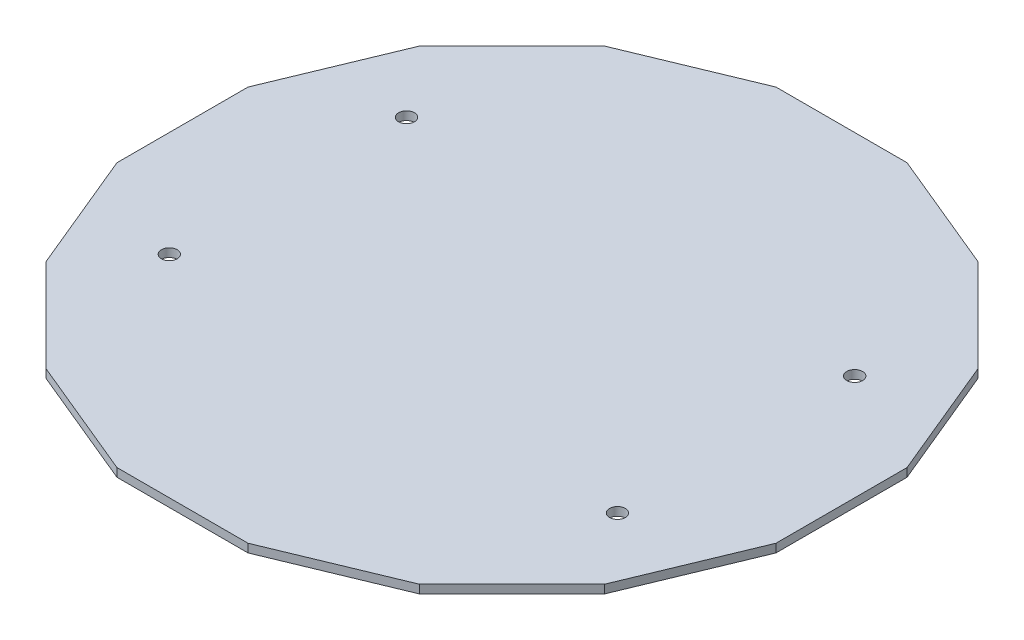
ISO-10303-21;
HEADER;
FILE_DESCRIPTION(('STEP AP214'),'2;1');
FILE_NAME('part.step','',(''),(''),'','','');
FILE_SCHEMA(('AUTOMOTIVE_DESIGN { 1 0 10303 214 1 1 1 1 }'));
ENDSEC;
DATA;
#1=APPLICATION_CONTEXT('core data for automotive mechanical design processes');
#2=APPLICATION_PROTOCOL_DEFINITION('international standard','automotive_design',2000,#1);
#3=PRODUCT_CONTEXT('',#1,'mechanical');
#4=PRODUCT('Part','Part','',(#3));
#5=PRODUCT_RELATED_PRODUCT_CATEGORY('part','',(#4));
#6=PRODUCT_DEFINITION_FORMATION('','',#4);
#7=PRODUCT_DEFINITION_CONTEXT('part definition',#1,'design');
#8=PRODUCT_DEFINITION('design','',#6,#7);
#9=PRODUCT_DEFINITION_SHAPE('','',#8);
#10=(LENGTH_UNIT() NAMED_UNIT(*) SI_UNIT(.MILLI.,.METRE.));
#11=(NAMED_UNIT(*) PLANE_ANGLE_UNIT() SI_UNIT($,.RADIAN.));
#12=(NAMED_UNIT(*) SI_UNIT($,.STERADIAN.) SOLID_ANGLE_UNIT());
#13=UNCERTAINTY_MEASURE_WITH_UNIT(LENGTH_MEASURE(1.E-05),#10,'distance_accuracy_value','');
#14=(GEOMETRIC_REPRESENTATION_CONTEXT(3) GLOBAL_UNCERTAINTY_ASSIGNED_CONTEXT((#13)) GLOBAL_UNIT_ASSIGNED_CONTEXT((#10,
#11,#12)) REPRESENTATION_CONTEXT('',''));
#15=CARTESIAN_POINT('',(0.,0.,0.));
#16=DIRECTION('',(0.,0.,1.));
#17=DIRECTION('',(1.,0.,0.));
#18=AXIS2_PLACEMENT_3D('',#15,#16,#17);
#19=CARTESIAN_POINT('',(62.5,1.6,12.4320229612286));
#20=DIRECTION('',(-1.,0.,0.));
#21=DIRECTION('',(0.,0.,1.));
#22=AXIS2_PLACEMENT_3D('',#19,#20,#21);
#23=PLANE('',#22);
#24=DIRECTION('',(0.,0.,-1.));
#25=VECTOR('',#24,1.);
#26=CARTESIAN_POINT('',(62.5,0.,12.4320229612286));
#27=LINE('',#26,#25);
#28=CARTESIAN_POINT('',(62.5,0.,12.4320229612286));
#29=VERTEX_POINT('',#28);
#30=CARTESIAN_POINT('',(62.5,0.,-12.4320229612286));
#31=VERTEX_POINT('',#30);
#32=EDGE_CURVE('E196',#29,#31,#27,.T.);
#33=ORIENTED_EDGE('',*,*,#32,.T.);
#34=DIRECTION('',(0.,-1.,0.));
#35=VECTOR('',#34,1.);
#36=CARTESIAN_POINT('',(62.5,1.6,-12.4320229612286));
#37=LINE('',#36,#35);
#38=CARTESIAN_POINT('',(62.5,1.6,-12.4320229612286));
#39=VERTEX_POINT('',#38);
#40=EDGE_CURVE('E11',#39,#31,#37,.T.);
#41=ORIENTED_EDGE('',*,*,#40,.F.);
#42=DIRECTION('',(0.,0.,-1.));
#43=VECTOR('',#42,1.);
#44=CARTESIAN_POINT('',(62.5,1.6,12.4320229612286));
#45=LINE('',#44,#43);
#46=CARTESIAN_POINT('',(62.5,1.6,12.4320229612286));
#47=VERTEX_POINT('',#46);
#48=EDGE_CURVE('E243',#47,#39,#45,.T.);
#49=ORIENTED_EDGE('',*,*,#48,.F.);
#50=DIRECTION('',(0.,-1.,0.));
#51=VECTOR('',#50,1.);
#52=CARTESIAN_POINT('',(62.5,1.6,12.4320229612286));
#53=LINE('',#52,#51);
#54=EDGE_CURVE('E192',#47,#29,#53,.T.);
#55=ORIENTED_EDGE('',*,*,#54,.T.);
#56=EDGE_LOOP('',(#33,#41,#49,#55));
#57=FACE_BOUND('',#56,.T.);
#58=ADVANCED_FACE('F47',(#57),#23,.F.);
#59=CARTESIAN_POINT('',(62.5,1.6,-12.4320229612286));
#60=DIRECTION('',(-0.923879532511287,0.,0.38268343236509));
#61=DIRECTION('',(0.38268343236509,0.,0.923879532511287));
#62=AXIS2_PLACEMENT_3D('',#59,#60,#61);
#63=PLANE('',#62);
#64=DIRECTION('',(-0.38268343236509,0.,-0.923879532511287));
#65=VECTOR('',#64,1.);
#66=CARTESIAN_POINT('',(62.5,0.,-12.4320229612286));
#67=LINE('',#66,#65);
#68=CARTESIAN_POINT('',(52.9849415639108,0.,-35.4034060844076));
#69=VERTEX_POINT('',#68);
#70=EDGE_CURVE('E200',#31,#69,#67,.T.);
#71=ORIENTED_EDGE('',*,*,#70,.T.);
#72=DIRECTION('',(0.,-1.,0.));
#73=VECTOR('',#72,1.);
#74=CARTESIAN_POINT('',(52.9849415639108,1.6,-35.4034060844076));
#75=LINE('',#74,#73);
#76=CARTESIAN_POINT('',(52.9849415639108,1.6,-35.4034060844076));
#77=VERTEX_POINT('',#76);
#78=EDGE_CURVE('E56',#77,#69,#75,.T.);
#79=ORIENTED_EDGE('',*,*,#78,.F.);
#80=DIRECTION('',(-0.38268343236509,0.,-0.923879532511287));
#81=VECTOR('',#80,1.);
#82=CARTESIAN_POINT('',(62.5,1.6,-12.4320229612286));
#83=LINE('',#82,#81);
#84=EDGE_CURVE('E131',#39,#77,#83,.T.);
#85=ORIENTED_EDGE('',*,*,#84,.F.);
#86=ORIENTED_EDGE('',*,*,#40,.T.);
#87=EDGE_LOOP('',(#71,#79,#85,#86));
#88=FACE_BOUND('',#87,.T.);
#89=ADVANCED_FACE('F366',(#88),#63,.F.);
#90=CARTESIAN_POINT('',(52.9849415639108,1.6,-35.4034060844076));
#91=DIRECTION('',(-0.707106781186548,0.,0.707106781186548));
#92=DIRECTION('',(0.707106781186548,0.,0.707106781186548));
#93=AXIS2_PLACEMENT_3D('',#90,#91,#92);
#94=PLANE('',#93);
#95=DIRECTION('',(-0.707106781186547,0.,-0.707106781186547));
#96=VECTOR('',#95,1.);
#97=CARTESIAN_POINT('',(52.9849415639108,0.,-35.4034060844076));
#98=LINE('',#97,#96);
#99=CARTESIAN_POINT('',(35.4034060844076,0.,-52.9849415639108));
#100=VERTEX_POINT('',#99);
#101=EDGE_CURVE('E204',#69,#100,#98,.T.);
#102=ORIENTED_EDGE('',*,*,#101,.T.);
#103=DIRECTION('',(0.,-1.,0.));
#104=VECTOR('',#103,1.);
#105=CARTESIAN_POINT('',(35.4034060844076,1.6,-52.9849415639108));
#106=LINE('',#105,#104);
#107=CARTESIAN_POINT('',(35.4034060844076,1.6,-52.9849415639108));
#108=VERTEX_POINT('',#107);
#109=EDGE_CURVE('E286',#108,#100,#106,.T.);
#110=ORIENTED_EDGE('',*,*,#109,.F.);
#111=DIRECTION('',(-0.707106781186547,0.,-0.707106781186547));
#112=VECTOR('',#111,1.);
#113=CARTESIAN_POINT('',(52.9849415639108,1.6,-35.4034060844076));
#114=LINE('',#113,#112);
#115=EDGE_CURVE('E296',#77,#108,#114,.T.);
#116=ORIENTED_EDGE('',*,*,#115,.F.);
#117=ORIENTED_EDGE('',*,*,#78,.T.);
#118=EDGE_LOOP('',(#102,#110,#116,#117));
#119=FACE_BOUND('',#118,.T.);
#120=ADVANCED_FACE('F294',(#119),#94,.F.);
#121=CARTESIAN_POINT('',(35.4034060844076,1.6,-52.9849415639108));
#122=DIRECTION('',(-0.382683432365089,0.,0.923879532511287));
#123=DIRECTION('',(0.923879532511287,0.,0.382683432365089));
#124=AXIS2_PLACEMENT_3D('',#121,#122,#123);
#125=PLANE('',#124);
#126=DIRECTION('',(-0.923879532511287,0.,-0.382683432365089));
#127=VECTOR('',#126,1.);
#128=CARTESIAN_POINT('',(35.4034060844076,0.,-52.9849415639108));
#129=LINE('',#128,#127);
#130=CARTESIAN_POINT('',(12.4320229612286,0.,-62.5));
#131=VERTEX_POINT('',#130);
#132=EDGE_CURVE('E207',#100,#131,#129,.T.);
#133=ORIENTED_EDGE('',*,*,#132,.T.);
#134=DIRECTION('',(0.,-1.,0.));
#135=VECTOR('',#134,1.);
#136=CARTESIAN_POINT('',(12.4320229612286,1.6,-62.5));
#137=LINE('',#136,#135);
#138=CARTESIAN_POINT('',(12.4320229612286,1.6,-62.5));
#139=VERTEX_POINT('',#138);
#140=EDGE_CURVE('E282',#139,#131,#137,.T.);
#141=ORIENTED_EDGE('',*,*,#140,.F.);
#142=DIRECTION('',(-0.923879532511287,0.,-0.382683432365089));
#143=VECTOR('',#142,1.);
#144=CARTESIAN_POINT('',(35.4034060844076,1.6,-52.9849415639108));
#145=LINE('',#144,#143);
#146=EDGE_CURVE('E315',#108,#139,#145,.T.);
#147=ORIENTED_EDGE('',*,*,#146,.F.);
#148=ORIENTED_EDGE('',*,*,#109,.T.);
#149=EDGE_LOOP('',(#133,#141,#147,#148));
#150=FACE_BOUND('',#149,.T.);
#151=ADVANCED_FACE('F305',(#150),#125,.F.);
#152=CARTESIAN_POINT('',(12.4320229612286,1.6,-62.5));
#153=DIRECTION('',(0.,0.,1.));
#154=DIRECTION('',(1.,0.,0.));
#155=AXIS2_PLACEMENT_3D('',#152,#153,#154);
#156=PLANE('',#155);
#157=DIRECTION('',(-1.,0.,0.));
#158=VECTOR('',#157,1.);
#159=CARTESIAN_POINT('',(12.4320229612286,0.,-62.5));
#160=LINE('',#159,#158);
#161=CARTESIAN_POINT('',(-12.4320229612286,0.,-62.5));
#162=VERTEX_POINT('',#161);
#163=EDGE_CURVE('E210',#131,#162,#160,.T.);
#164=ORIENTED_EDGE('',*,*,#163,.T.);
#165=DIRECTION('',(0.,-1.,0.));
#166=VECTOR('',#165,1.);
#167=CARTESIAN_POINT('',(-12.4320229612286,1.6,-62.5));
#168=LINE('',#167,#166);
#169=CARTESIAN_POINT('',(-12.4320229612286,1.6,-62.5));
#170=VERTEX_POINT('',#169);
#171=EDGE_CURVE('E278',#170,#162,#168,.T.);
#172=ORIENTED_EDGE('',*,*,#171,.F.);
#173=DIRECTION('',(-1.,0.,0.));
#174=VECTOR('',#173,1.);
#175=CARTESIAN_POINT('',(12.4320229612286,1.6,-62.5));
#176=LINE('',#175,#174);
#177=EDGE_CURVE('E311',#139,#170,#176,.T.);
#178=ORIENTED_EDGE('',*,*,#177,.F.);
#179=ORIENTED_EDGE('',*,*,#140,.T.);
#180=EDGE_LOOP('',(#164,#172,#178,#179));
#181=FACE_BOUND('',#180,.T.);
#182=ADVANCED_FACE('F309',(#181),#156,.F.);
#183=CARTESIAN_POINT('',(-12.4320229612286,1.6,-62.5));
#184=DIRECTION('',(0.38268343236509,0.,0.923879532511287));
#185=DIRECTION('',(0.923879532511287,0.,-0.38268343236509));
#186=AXIS2_PLACEMENT_3D('',#183,#184,#185);
#187=PLANE('',#186);
#188=DIRECTION('',(-0.923879532511287,0.,0.38268343236509));
#189=VECTOR('',#188,1.);
#190=CARTESIAN_POINT('',(-12.4320229612286,0.,-62.5));
#191=LINE('',#190,#189);
#192=CARTESIAN_POINT('',(-35.4034060844076,0.,-52.9849415639108));
#193=VERTEX_POINT('',#192);
#194=EDGE_CURVE('E213',#162,#193,#191,.T.);
#195=ORIENTED_EDGE('',*,*,#194,.T.);
#196=DIRECTION('',(0.,-1.,0.));
#197=VECTOR('',#196,1.);
#198=CARTESIAN_POINT('',(-35.4034060844076,1.6,-52.9849415639108));
#199=LINE('',#198,#197);
#200=CARTESIAN_POINT('',(-35.4034060844076,1.6,-52.9849415639108));
#201=VERTEX_POINT('',#200);
#202=EDGE_CURVE('E274',#201,#193,#199,.T.);
#203=ORIENTED_EDGE('',*,*,#202,.F.);
#204=DIRECTION('',(-0.923879532511287,0.,0.38268343236509));
#205=VECTOR('',#204,1.);
#206=CARTESIAN_POINT('',(-12.4320229612286,1.6,-62.5));
#207=LINE('',#206,#205);
#208=EDGE_CURVE('E314',#170,#201,#207,.T.);
#209=ORIENTED_EDGE('',*,*,#208,.F.);
#210=ORIENTED_EDGE('',*,*,#171,.T.);
#211=EDGE_LOOP('',(#195,#203,#209,#210));
#212=FACE_BOUND('',#211,.T.);
#213=ADVANCED_FACE('F379',(#212),#187,.F.);
#214=CARTESIAN_POINT('',(-35.4034060844076,1.6,-52.9849415639108));
#215=DIRECTION('',(0.707106781186548,0.,0.707106781186547));
#216=DIRECTION('',(0.707106781186547,0.,-0.707106781186548));
#217=AXIS2_PLACEMENT_3D('',#214,#215,#216);
#218=PLANE('',#217);
#219=DIRECTION('',(-0.707106781186547,0.,0.707106781186548));
#220=VECTOR('',#219,1.);
#221=CARTESIAN_POINT('',(-35.4034060844076,0.,-52.9849415639108));
#222=LINE('',#221,#220);
#223=CARTESIAN_POINT('',(-52.9849415639109,0.,-35.4034060844075));
#224=VERTEX_POINT('',#223);
#225=EDGE_CURVE('E216',#193,#224,#222,.T.);
#226=ORIENTED_EDGE('',*,*,#225,.T.);
#227=DIRECTION('',(0.,-1.,0.));
#228=VECTOR('',#227,1.);
#229=CARTESIAN_POINT('',(-52.9849415639109,1.6,-35.4034060844075));
#230=LINE('',#229,#228);
#231=CARTESIAN_POINT('',(-52.9849415639109,1.6,-35.4034060844075));
#232=VERTEX_POINT('',#231);
#233=EDGE_CURVE('E270',#232,#224,#230,.T.);
#234=ORIENTED_EDGE('',*,*,#233,.F.);
#235=DIRECTION('',(-0.707106781186547,0.,0.707106781186548));
#236=VECTOR('',#235,1.);
#237=CARTESIAN_POINT('',(-35.4034060844076,1.6,-52.9849415639108));
#238=LINE('',#237,#236);
#239=EDGE_CURVE('E319',#201,#232,#238,.T.);
#240=ORIENTED_EDGE('',*,*,#239,.F.);
#241=ORIENTED_EDGE('',*,*,#202,.T.);
#242=EDGE_LOOP('',(#226,#234,#240,#241));
#243=FACE_BOUND('',#242,.T.);
#244=ADVANCED_FACE('F382',(#243),#218,.F.);
#245=CARTESIAN_POINT('',(-52.9849415639109,1.6,-35.4034060844075));
#246=DIRECTION('',(0.923879532511287,0.,0.382683432365089));
#247=DIRECTION('',(0.38268343236509,0.,-0.923879532511287));
#248=AXIS2_PLACEMENT_3D('',#245,#246,#247);
#249=PLANE('',#248);
#250=DIRECTION('',(-0.382683432365089,0.,0.923879532511287));
#251=VECTOR('',#250,1.);
#252=CARTESIAN_POINT('',(-52.9849415639109,0.,-35.4034060844075));
#253=LINE('',#252,#251);
#254=CARTESIAN_POINT('',(-62.5,0.,-12.4320229612286));
#255=VERTEX_POINT('',#254);
#256=EDGE_CURVE('E219',#224,#255,#253,.T.);
#257=ORIENTED_EDGE('',*,*,#256,.T.);
#258=DIRECTION('',(0.,-1.,0.));
#259=VECTOR('',#258,1.);
#260=CARTESIAN_POINT('',(-62.5,1.6,-12.4320229612286));
#261=LINE('',#260,#259);
#262=CARTESIAN_POINT('',(-62.5,1.6,-12.4320229612286));
#263=VERTEX_POINT('',#262);
#264=EDGE_CURVE('E266',#263,#255,#261,.T.);
#265=ORIENTED_EDGE('',*,*,#264,.F.);
#266=DIRECTION('',(-0.382683432365089,0.,0.923879532511287));
#267=VECTOR('',#266,1.);
#268=CARTESIAN_POINT('',(-52.9849415639109,1.6,-35.4034060844075));
#269=LINE('',#268,#267);
#270=EDGE_CURVE('E326',#232,#263,#269,.T.);
#271=ORIENTED_EDGE('',*,*,#270,.F.);
#272=ORIENTED_EDGE('',*,*,#233,.T.);
#273=EDGE_LOOP('',(#257,#265,#271,#272));
#274=FACE_BOUND('',#273,.T.);
#275=ADVANCED_FACE('F386',(#274),#249,.F.);
#276=CARTESIAN_POINT('',(-62.5,1.6,-12.4320229612286));
#277=DIRECTION('',(1.,0.,0.));
#278=DIRECTION('',(0.,0.,-1.));
#279=AXIS2_PLACEMENT_3D('',#276,#277,#278);
#280=PLANE('',#279);
#281=DIRECTION('',(0.,0.,1.));
#282=VECTOR('',#281,1.);
#283=CARTESIAN_POINT('',(-62.5,0.,-12.4320229612286));
#284=LINE('',#283,#282);
#285=CARTESIAN_POINT('',(-62.5,0.,12.4320229612287));
#286=VERTEX_POINT('',#285);
#287=EDGE_CURVE('E222',#255,#286,#284,.T.);
#288=ORIENTED_EDGE('',*,*,#287,.T.);
#289=DIRECTION('',(0.,-1.,0.));
#290=VECTOR('',#289,1.);
#291=CARTESIAN_POINT('',(-62.5,1.6,12.4320229612287));
#292=LINE('',#291,#290);
#293=CARTESIAN_POINT('',(-62.5,1.6,12.4320229612287));
#294=VERTEX_POINT('',#293);
#295=EDGE_CURVE('E262',#294,#286,#292,.T.);
#296=ORIENTED_EDGE('',*,*,#295,.F.);
#297=DIRECTION('',(0.,0.,1.));
#298=VECTOR('',#297,1.);
#299=CARTESIAN_POINT('',(-62.5,1.6,-12.4320229612286));
#300=LINE('',#299,#298);
#301=EDGE_CURVE('E329',#263,#294,#300,.T.);
#302=ORIENTED_EDGE('',*,*,#301,.F.);
#303=ORIENTED_EDGE('',*,*,#264,.T.);
#304=EDGE_LOOP('',(#288,#296,#302,#303));
#305=FACE_BOUND('',#304,.T.);
#306=ADVANCED_FACE('F390',(#305),#280,.F.);
#307=CARTESIAN_POINT('',(-62.5,1.6,12.4320229612287));
#308=DIRECTION('',(0.923879532511287,0.,-0.38268343236509));
#309=DIRECTION('',(-0.38268343236509,0.,-0.923879532511287));
#310=AXIS2_PLACEMENT_3D('',#307,#308,#309);
#311=PLANE('',#310);
#312=DIRECTION('',(0.38268343236509,0.,0.923879532511287));
#313=VECTOR('',#312,1.);
#314=CARTESIAN_POINT('',(-62.5,0.,12.4320229612287));
#315=LINE('',#314,#313);
#316=CARTESIAN_POINT('',(-52.9849415639108,0.,35.4034060844077));
#317=VERTEX_POINT('',#316);
#318=EDGE_CURVE('E225',#286,#317,#315,.T.);
#319=ORIENTED_EDGE('',*,*,#318,.T.);
#320=DIRECTION('',(0.,-1.,0.));
#321=VECTOR('',#320,1.);
#322=CARTESIAN_POINT('',(-52.9849415639108,1.6,35.4034060844077));
#323=LINE('',#322,#321);
#324=CARTESIAN_POINT('',(-52.9849415639108,1.6,35.4034060844077));
#325=VERTEX_POINT('',#324);
#326=EDGE_CURVE('E258',#325,#317,#323,.T.);
#327=ORIENTED_EDGE('',*,*,#326,.F.);
#328=DIRECTION('',(0.38268343236509,0.,0.923879532511287));
#329=VECTOR('',#328,1.);
#330=CARTESIAN_POINT('',(-62.5,1.6,12.4320229612287));
#331=LINE('',#330,#329);
#332=EDGE_CURVE('E332',#294,#325,#331,.T.);
#333=ORIENTED_EDGE('',*,*,#332,.F.);
#334=ORIENTED_EDGE('',*,*,#295,.T.);
#335=EDGE_LOOP('',(#319,#327,#333,#334));
#336=FACE_BOUND('',#335,.T.);
#337=ADVANCED_FACE('F394',(#336),#311,.F.);
#338=CARTESIAN_POINT('',(-52.9849415639108,1.6,35.4034060844077));
#339=DIRECTION('',(0.707106781186547,0.,-0.707106781186548));
#340=DIRECTION('',(-0.707106781186548,0.,-0.707106781186547));
#341=AXIS2_PLACEMENT_3D('',#338,#339,#340);
#342=PLANE('',#341);
#343=DIRECTION('',(0.707106781186548,0.,0.707106781186547));
#344=VECTOR('',#343,1.);
#345=CARTESIAN_POINT('',(-52.9849415639108,0.,35.4034060844077));
#346=LINE('',#345,#344);
#347=CARTESIAN_POINT('',(-35.4034060844076,0.,52.9849415639109));
#348=VERTEX_POINT('',#347);
#349=EDGE_CURVE('E228',#317,#348,#346,.T.);
#350=ORIENTED_EDGE('',*,*,#349,.T.);
#351=DIRECTION('',(0.,-1.,0.));
#352=VECTOR('',#351,1.);
#353=CARTESIAN_POINT('',(-35.4034060844076,1.6,52.9849415639109));
#354=LINE('',#353,#352);
#355=CARTESIAN_POINT('',(-35.4034060844076,1.6,52.9849415639109));
#356=VERTEX_POINT('',#355);
#357=EDGE_CURVE('E254',#356,#348,#354,.T.);
#358=ORIENTED_EDGE('',*,*,#357,.F.);
#359=DIRECTION('',(0.707106781186548,0.,0.707106781186547));
#360=VECTOR('',#359,1.);
#361=CARTESIAN_POINT('',(-52.9849415639108,1.6,35.4034060844077));
#362=LINE('',#361,#360);
#363=EDGE_CURVE('E335',#325,#356,#362,.T.);
#364=ORIENTED_EDGE('',*,*,#363,.F.);
#365=ORIENTED_EDGE('',*,*,#326,.T.);
#366=EDGE_LOOP('',(#350,#358,#364,#365));
#367=FACE_BOUND('',#366,.T.);
#368=ADVANCED_FACE('F398',(#367),#342,.F.);
#369=CARTESIAN_POINT('',(-35.4034060844076,1.6,52.9849415639109));
#370=DIRECTION('',(0.382683432365089,0.,-0.923879532511287));
#371=DIRECTION('',(-0.923879532511287,0.,-0.382683432365089));
#372=AXIS2_PLACEMENT_3D('',#369,#370,#371);
#373=PLANE('',#372);
#374=DIRECTION('',(0.923879532511287,0.,0.382683432365089));
#375=VECTOR('',#374,1.);
#376=CARTESIAN_POINT('',(-35.4034060844076,0.,52.9849415639109));
#377=LINE('',#376,#375);
#378=CARTESIAN_POINT('',(-12.4320229612286,0.,62.5));
#379=VERTEX_POINT('',#378);
#380=EDGE_CURVE('E231',#348,#379,#377,.T.);
#381=ORIENTED_EDGE('',*,*,#380,.T.);
#382=DIRECTION('',(0.,-1.,0.));
#383=VECTOR('',#382,1.);
#384=CARTESIAN_POINT('',(-12.4320229612286,1.6,62.5));
#385=LINE('',#384,#383);
#386=CARTESIAN_POINT('',(-12.4320229612286,1.6,62.5));
#387=VERTEX_POINT('',#386);
#388=EDGE_CURVE('E250',#387,#379,#385,.T.);
#389=ORIENTED_EDGE('',*,*,#388,.F.);
#390=DIRECTION('',(0.923879532511287,0.,0.382683432365089));
#391=VECTOR('',#390,1.);
#392=CARTESIAN_POINT('',(-35.4034060844076,1.6,52.9849415639109));
#393=LINE('',#392,#391);
#394=EDGE_CURVE('E338',#356,#387,#393,.T.);
#395=ORIENTED_EDGE('',*,*,#394,.F.);
#396=ORIENTED_EDGE('',*,*,#357,.T.);
#397=EDGE_LOOP('',(#381,#389,#395,#396));
#398=FACE_BOUND('',#397,.T.);
#399=ADVANCED_FACE('F346',(#398),#373,.F.);
#400=CARTESIAN_POINT('',(-12.4320229612286,1.6,62.5));
#401=DIRECTION('',(0.,0.,-1.));
#402=DIRECTION('',(-1.,0.,0.));
#403=AXIS2_PLACEMENT_3D('',#400,#401,#402);
#404=PLANE('',#403);
#405=DIRECTION('',(1.,0.,0.));
#406=VECTOR('',#405,1.);
#407=CARTESIAN_POINT('',(-12.4320229612286,0.,62.5));
#408=LINE('',#407,#406);
#409=CARTESIAN_POINT('',(12.4320229612287,0.,62.5));
#410=VERTEX_POINT('',#409);
#411=EDGE_CURVE('E234',#379,#410,#408,.T.);
#412=ORIENTED_EDGE('',*,*,#411,.T.);
#413=DIRECTION('',(0.,-1.,0.));
#414=VECTOR('',#413,1.);
#415=CARTESIAN_POINT('',(12.4320229612287,1.6,62.5));
#416=LINE('',#415,#414);
#417=CARTESIAN_POINT('',(12.4320229612287,1.6,62.5));
#418=VERTEX_POINT('',#417);
#419=EDGE_CURVE('E185',#418,#410,#416,.T.);
#420=ORIENTED_EDGE('',*,*,#419,.F.);
#421=DIRECTION('',(1.,0.,0.));
#422=VECTOR('',#421,1.);
#423=CARTESIAN_POINT('',(-12.4320229612286,1.6,62.5));
#424=LINE('',#423,#422);
#425=EDGE_CURVE('E174',#387,#418,#424,.T.);
#426=ORIENTED_EDGE('',*,*,#425,.F.);
#427=ORIENTED_EDGE('',*,*,#388,.T.);
#428=EDGE_LOOP('',(#412,#420,#426,#427));
#429=FACE_BOUND('',#428,.T.);
#430=ADVANCED_FACE('F350',(#429),#404,.F.);
#431=CARTESIAN_POINT('',(12.4320229612287,1.6,62.5));
#432=DIRECTION('',(-0.382683432365089,0.,-0.923879532511287));
#433=DIRECTION('',(-0.923879532511287,0.,0.382683432365089));
#434=AXIS2_PLACEMENT_3D('',#431,#432,#433);
#435=PLANE('',#434);
#436=DIRECTION('',(0.923879532511287,0.,-0.382683432365089));
#437=VECTOR('',#436,1.);
#438=CARTESIAN_POINT('',(12.4320229612287,0.,62.5));
#439=LINE('',#438,#437);
#440=CARTESIAN_POINT('',(35.4034060844076,0.,52.9849415639109));
#441=VERTEX_POINT('',#440);
#442=EDGE_CURVE('E183',#410,#441,#439,.T.);
#443=ORIENTED_EDGE('',*,*,#442,.T.);
#444=DIRECTION('',(0.,-1.,0.));
#445=VECTOR('',#444,1.);
#446=CARTESIAN_POINT('',(35.4034060844076,1.6,52.9849415639109));
#447=LINE('',#446,#445);
#448=CARTESIAN_POINT('',(35.4034060844076,1.6,52.9849415639109));
#449=VERTEX_POINT('',#448);
#450=EDGE_CURVE('E180',#449,#441,#447,.T.);
#451=ORIENTED_EDGE('',*,*,#450,.F.);
#452=DIRECTION('',(0.923879532511287,0.,-0.382683432365089));
#453=VECTOR('',#452,1.);
#454=CARTESIAN_POINT('',(12.4320229612287,1.6,62.5));
#455=LINE('',#454,#453);
#456=EDGE_CURVE('E168',#418,#449,#455,.T.);
#457=ORIENTED_EDGE('',*,*,#456,.F.);
#458=ORIENTED_EDGE('',*,*,#419,.T.);
#459=EDGE_LOOP('',(#443,#451,#457,#458));
#460=FACE_BOUND('',#459,.T.);
#461=ADVANCED_FACE('F181',(#460),#435,.F.);
#462=CARTESIAN_POINT('',(35.4034060844076,1.6,52.9849415639109));
#463=DIRECTION('',(-0.707106781186548,0.,-0.707106781186547));
#464=DIRECTION('',(-0.707106781186547,0.,0.707106781186548));
#465=AXIS2_PLACEMENT_3D('',#462,#463,#464);
#466=PLANE('',#465);
#467=DIRECTION('',(0.707106781186547,0.,-0.707106781186548));
#468=VECTOR('',#467,1.);
#469=CARTESIAN_POINT('',(35.4034060844076,0.,52.9849415639109));
#470=LINE('',#469,#468);
#471=CARTESIAN_POINT('',(52.9849415639109,0.,35.4034060844076));
#472=VERTEX_POINT('',#471);
#473=EDGE_CURVE('E117',#441,#472,#470,.T.);
#474=ORIENTED_EDGE('',*,*,#473,.T.);
#475=DIRECTION('',(0.,-1.,0.));
#476=VECTOR('',#475,1.);
#477=CARTESIAN_POINT('',(52.9849415639109,1.6,35.4034060844076));
#478=LINE('',#477,#476);
#479=CARTESIAN_POINT('',(52.9849415639109,1.6,35.4034060844076));
#480=VERTEX_POINT('',#479);
#481=EDGE_CURVE('E186',#480,#472,#478,.T.);
#482=ORIENTED_EDGE('',*,*,#481,.F.);
#483=DIRECTION('',(0.707106781186547,0.,-0.707106781186548));
#484=VECTOR('',#483,1.);
#485=CARTESIAN_POINT('',(35.4034060844076,1.6,52.9849415639109));
#486=LINE('',#485,#484);
#487=EDGE_CURVE('E172',#449,#480,#486,.T.);
#488=ORIENTED_EDGE('',*,*,#487,.F.);
#489=ORIENTED_EDGE('',*,*,#450,.T.);
#490=EDGE_LOOP('',(#474,#482,#488,#489));
#491=FACE_BOUND('',#490,.T.);
#492=ADVANCED_FACE('F188',(#491),#466,.F.);
#493=CARTESIAN_POINT('',(52.9849415639109,1.6,35.4034060844076));
#494=DIRECTION('',(-0.923879532511287,0.,-0.38268343236509));
#495=DIRECTION('',(-0.38268343236509,0.,0.923879532511287));
#496=AXIS2_PLACEMENT_3D('',#493,#494,#495);
#497=PLANE('',#496);
#498=DIRECTION('',(0.38268343236509,0.,-0.923879532511287));
#499=VECTOR('',#498,1.);
#500=CARTESIAN_POINT('',(52.9849415639109,0.,35.4034060844076));
#501=LINE('',#500,#499);
#502=EDGE_CURVE('E123',#472,#29,#501,.T.);
#503=ORIENTED_EDGE('',*,*,#502,.T.);
#504=ORIENTED_EDGE('',*,*,#54,.F.);
#505=DIRECTION('',(0.38268343236509,0.,-0.923879532511287));
#506=VECTOR('',#505,1.);
#507=CARTESIAN_POINT('',(52.9849415639109,1.6,35.4034060844076));
#508=LINE('',#507,#506);
#509=EDGE_CURVE('E64',#480,#47,#508,.T.);
#510=ORIENTED_EDGE('',*,*,#509,.F.);
#511=ORIENTED_EDGE('',*,*,#481,.T.);
#512=EDGE_LOOP('',(#503,#504,#510,#511));
#513=FACE_BOUND('',#512,.T.);
#514=ADVANCED_FACE('F354',(#513),#497,.F.);
#515=CARTESIAN_POINT('',(0.,1.6,0.));
#516=DIRECTION('',(0.,1.,0.));
#517=DIRECTION('',(0.,0.,1.));
#518=AXIS2_PLACEMENT_3D('',#515,#516,#517);
#519=PLANE('',#518);
#520=CARTESIAN_POINT('',(42.5,1.6,-22.5));
#521=DIRECTION('',(0.,1.,0.));
#522=DIRECTION('',(0.,0.,1.));
#523=AXIS2_PLACEMENT_3D('',#520,#521,#522);
#524=CIRCLE('',#523,1.5);
#525=CARTESIAN_POINT('',(42.5,1.6,-21.));
#526=VERTEX_POINT('',#525);
#527=EDGE_CURVE('E646',#526,#526,#524,.T.);
#528=ORIENTED_EDGE('',*,*,#527,.F.);
#529=EDGE_LOOP('',(#528));
#530=FACE_BOUND('',#529,.T.);
#531=CARTESIAN_POINT('',(42.5,1.6,22.5));
#532=DIRECTION('',(0.,1.,0.));
#533=DIRECTION('',(0.,0.,1.));
#534=AXIS2_PLACEMENT_3D('',#531,#532,#533);
#535=CIRCLE('',#534,1.5);
#536=CARTESIAN_POINT('',(42.5,1.6,24.));
#537=VERTEX_POINT('',#536);
#538=EDGE_CURVE('E653',#537,#537,#535,.T.);
#539=ORIENTED_EDGE('',*,*,#538,.F.);
#540=EDGE_LOOP('',(#539));
#541=FACE_BOUND('',#540,.T.);
#542=CARTESIAN_POINT('',(-42.5,1.6,22.5));
#543=DIRECTION('',(0.,1.,0.));
#544=DIRECTION('',(0.,0.,1.));
#545=AXIS2_PLACEMENT_3D('',#542,#543,#544);
#546=CIRCLE('',#545,1.5);
#547=CARTESIAN_POINT('',(-42.5,1.6,24.));
#548=VERTEX_POINT('',#547);
#549=EDGE_CURVE('E662',#548,#548,#546,.T.);
#550=ORIENTED_EDGE('',*,*,#549,.F.);
#551=EDGE_LOOP('',(#550));
#552=FACE_BOUND('',#551,.T.);
#553=CARTESIAN_POINT('',(-42.5,1.6,-22.5));
#554=DIRECTION('',(0.,1.,0.));
#555=DIRECTION('',(0.,0.,1.));
#556=AXIS2_PLACEMENT_3D('',#553,#554,#555);
#557=CIRCLE('',#556,1.5);
#558=CARTESIAN_POINT('',(-42.5,1.6,-21.));
#559=VERTEX_POINT('',#558);
#560=EDGE_CURVE('E658',#559,#559,#557,.T.);
#561=ORIENTED_EDGE('',*,*,#560,.F.);
#562=EDGE_LOOP('',(#561));
#563=FACE_BOUND('',#562,.T.);
#564=ORIENTED_EDGE('',*,*,#48,.T.);
#565=ORIENTED_EDGE('',*,*,#84,.T.);
#566=ORIENTED_EDGE('',*,*,#115,.T.);
#567=ORIENTED_EDGE('',*,*,#146,.T.);
#568=ORIENTED_EDGE('',*,*,#177,.T.);
#569=ORIENTED_EDGE('',*,*,#208,.T.);
#570=ORIENTED_EDGE('',*,*,#239,.T.);
#571=ORIENTED_EDGE('',*,*,#270,.T.);
#572=ORIENTED_EDGE('',*,*,#301,.T.);
#573=ORIENTED_EDGE('',*,*,#332,.T.);
#574=ORIENTED_EDGE('',*,*,#363,.T.);
#575=ORIENTED_EDGE('',*,*,#394,.T.);
#576=ORIENTED_EDGE('',*,*,#425,.T.);
#577=ORIENTED_EDGE('',*,*,#456,.T.);
#578=ORIENTED_EDGE('',*,*,#487,.T.);
#579=ORIENTED_EDGE('',*,*,#509,.T.);
#580=EDGE_LOOP('',(#564,#565,#566,#567,#568,#569,#570,#571,#572,#573,#574,#575,#576,#577,#578,#579));
#581=FACE_BOUND('',#580,.T.);
#582=ADVANCED_FACE('F170',(#530,#541,#552,#563,#581),#519,.T.);
#583=CARTESIAN_POINT('',(0.,0.,0.));
#584=DIRECTION('',(0.,1.,0.));
#585=DIRECTION('',(0.,0.,1.));
#586=AXIS2_PLACEMENT_3D('',#583,#584,#585);
#587=PLANE('',#586);
#588=CARTESIAN_POINT('',(42.5,0.,-22.5));
#589=DIRECTION('',(0.,1.,0.));
#590=DIRECTION('',(0.,0.,1.));
#591=AXIS2_PLACEMENT_3D('',#588,#589,#590);
#592=CIRCLE('',#591,1.5);
#593=CARTESIAN_POINT('',(42.5,0.,-21.));
#594=VERTEX_POINT('',#593);
#595=EDGE_CURVE('E643',#594,#594,#592,.F.);
#596=ORIENTED_EDGE('',*,*,#595,.F.);
#597=EDGE_LOOP('',(#596));
#598=FACE_BOUND('',#597,.T.);
#599=CARTESIAN_POINT('',(42.5,0.,22.5));
#600=DIRECTION('',(0.,1.,0.));
#601=DIRECTION('',(0.,0.,1.));
#602=AXIS2_PLACEMENT_3D('',#599,#600,#601);
#603=CIRCLE('',#602,1.5);
#604=CARTESIAN_POINT('',(42.5,0.,24.));
#605=VERTEX_POINT('',#604);
#606=EDGE_CURVE('E648',#605,#605,#603,.F.);
#607=ORIENTED_EDGE('',*,*,#606,.F.);
#608=EDGE_LOOP('',(#607));
#609=FACE_BOUND('',#608,.T.);
#610=CARTESIAN_POINT('',(-42.5,0.,22.5));
#611=DIRECTION('',(0.,1.,0.));
#612=DIRECTION('',(0.,0.,1.));
#613=AXIS2_PLACEMENT_3D('',#610,#611,#612);
#614=CIRCLE('',#613,1.5);
#615=CARTESIAN_POINT('',(-42.5,0.,24.));
#616=VERTEX_POINT('',#615);
#617=EDGE_CURVE('E673',#616,#616,#614,.F.);
#618=ORIENTED_EDGE('',*,*,#617,.F.);
#619=EDGE_LOOP('',(#618));
#620=FACE_BOUND('',#619,.T.);
#621=CARTESIAN_POINT('',(-42.5,0.,-22.5));
#622=DIRECTION('',(0.,1.,0.));
#623=DIRECTION('',(0.,0.,1.));
#624=AXIS2_PLACEMENT_3D('',#621,#622,#623);
#625=CIRCLE('',#624,1.5);
#626=CARTESIAN_POINT('',(-42.5,0.,-21.));
#627=VERTEX_POINT('',#626);
#628=EDGE_CURVE('E201',#627,#627,#625,.F.);
#629=ORIENTED_EDGE('',*,*,#628,.F.);
#630=EDGE_LOOP('',(#629));
#631=FACE_BOUND('',#630,.T.);
#632=ORIENTED_EDGE('',*,*,#32,.F.);
#633=ORIENTED_EDGE('',*,*,#502,.F.);
#634=ORIENTED_EDGE('',*,*,#473,.F.);
#635=ORIENTED_EDGE('',*,*,#442,.F.);
#636=ORIENTED_EDGE('',*,*,#411,.F.);
#637=ORIENTED_EDGE('',*,*,#380,.F.);
#638=ORIENTED_EDGE('',*,*,#349,.F.);
#639=ORIENTED_EDGE('',*,*,#318,.F.);
#640=ORIENTED_EDGE('',*,*,#287,.F.);
#641=ORIENTED_EDGE('',*,*,#256,.F.);
#642=ORIENTED_EDGE('',*,*,#225,.F.);
#643=ORIENTED_EDGE('',*,*,#194,.F.);
#644=ORIENTED_EDGE('',*,*,#163,.F.);
#645=ORIENTED_EDGE('',*,*,#132,.F.);
#646=ORIENTED_EDGE('',*,*,#101,.F.);
#647=ORIENTED_EDGE('',*,*,#70,.F.);
#648=EDGE_LOOP('',(#632,#633,#634,#635,#636,#637,#638,#639,#640,#641,#642,#643,#644,#645,#646,#647));
#649=FACE_BOUND('',#648,.T.);
#650=ADVANCED_FACE('F300',(#598,#609,#620,#631,#649),#587,.F.);
#651=CARTESIAN_POINT('',(-42.5,-4.24264068711929,-22.5));
#652=DIRECTION('',(0.,1.,0.));
#653=DIRECTION('',(0.,0.,1.));
#654=AXIS2_PLACEMENT_3D('',#651,#652,#653);
#655=CYLINDRICAL_SURFACE('',#654,1.5);
#656=CARTESIAN_POINT('',(-42.5,0.,-21.));
#657=CARTESIAN_POINT('',(-42.5,0.0166666666666666,-21.));
#658=CARTESIAN_POINT('',(-42.5,0.0333333333333331,-21.));
#659=CARTESIAN_POINT('',(-42.5,0.0666666666666666,-21.));
#660=CARTESIAN_POINT('',(-42.5,0.0833333333333334,-21.));
#661=CARTESIAN_POINT('',(-42.5,0.116666666666667,-21.));
#662=CARTESIAN_POINT('',(-42.5,0.133333333333333,-21.));
#663=CARTESIAN_POINT('',(-42.5,0.166666666666667,-21.));
#664=CARTESIAN_POINT('',(-42.5,0.183333333333334,-21.));
#665=CARTESIAN_POINT('',(-42.5,0.216666666666667,-21.));
#666=CARTESIAN_POINT('',(-42.5,0.233333333333334,-21.));
#667=CARTESIAN_POINT('',(-42.5,0.266666666666667,-21.));
#668=CARTESIAN_POINT('',(-42.5,0.283333333333333,-21.));
#669=CARTESIAN_POINT('',(-42.5,0.316666666666667,-21.));
#670=CARTESIAN_POINT('',(-42.5,0.333333333333334,-21.));
#671=CARTESIAN_POINT('',(-42.5,0.366666666666667,-21.));
#672=CARTESIAN_POINT('',(-42.5,0.383333333333334,-21.));
#673=CARTESIAN_POINT('',(-42.5,0.416666666666667,-21.));
#674=CARTESIAN_POINT('',(-42.5,0.433333333333333,-21.));
#675=CARTESIAN_POINT('',(-42.5,0.466666666666667,-21.));
#676=CARTESIAN_POINT('',(-42.5,0.483333333333334,-21.));
#677=CARTESIAN_POINT('',(-42.5,0.516666666666667,-21.));
#678=CARTESIAN_POINT('',(-42.5,0.533333333333334,-21.));
#679=CARTESIAN_POINT('',(-42.5,0.566666666666667,-21.));
#680=CARTESIAN_POINT('',(-42.5,0.583333333333333,-21.));
#681=CARTESIAN_POINT('',(-42.5,0.616666666666667,-21.));
#682=CARTESIAN_POINT('',(-42.5,0.633333333333334,-21.));
#683=CARTESIAN_POINT('',(-42.5,0.666666666666667,-21.));
#684=CARTESIAN_POINT('',(-42.5,0.683333333333334,-21.));
#685=CARTESIAN_POINT('',(-42.5,0.716666666666667,-21.));
#686=CARTESIAN_POINT('',(-42.5,0.733333333333334,-21.));
#687=CARTESIAN_POINT('',(-42.5,0.766666666666667,-21.));
#688=CARTESIAN_POINT('',(-42.5,0.783333333333334,-21.));
#689=CARTESIAN_POINT('',(-42.5,0.816666666666667,-21.));
#690=CARTESIAN_POINT('',(-42.5,0.833333333333333,-21.));
#691=CARTESIAN_POINT('',(-42.5,0.866666666666667,-21.));
#692=CARTESIAN_POINT('',(-42.5,0.883333333333334,-21.));
#693=CARTESIAN_POINT('',(-42.5,0.916666666666667,-21.));
#694=CARTESIAN_POINT('',(-42.5,0.933333333333334,-21.));
#695=CARTESIAN_POINT('',(-42.5,0.966666666666667,-21.));
#696=CARTESIAN_POINT('',(-42.5,0.983333333333334,-21.));
#697=CARTESIAN_POINT('',(-42.5,1.01666666666667,-21.));
#698=CARTESIAN_POINT('',(-42.5,1.03333333333333,-21.));
#699=CARTESIAN_POINT('',(-42.5,1.06666666666667,-21.));
#700=CARTESIAN_POINT('',(-42.5,1.08333333333333,-21.));
#701=CARTESIAN_POINT('',(-42.5,1.11666666666667,-21.));
#702=CARTESIAN_POINT('',(-42.5,1.13333333333333,-21.));
#703=CARTESIAN_POINT('',(-42.5,1.16666666666667,-21.));
#704=CARTESIAN_POINT('',(-42.5,1.18333333333333,-21.));
#705=CARTESIAN_POINT('',(-42.5,1.21666666666667,-21.));
#706=CARTESIAN_POINT('',(-42.5,1.23333333333333,-21.));
#707=CARTESIAN_POINT('',(-42.5,1.26666666666667,-21.));
#708=CARTESIAN_POINT('',(-42.5,1.28333333333333,-21.));
#709=CARTESIAN_POINT('',(-42.5,1.31666666666667,-21.));
#710=CARTESIAN_POINT('',(-42.5,1.33333333333333,-21.));
#711=CARTESIAN_POINT('',(-42.5,1.36666666666667,-21.));
#712=CARTESIAN_POINT('',(-42.5,1.38333333333333,-21.));
#713=CARTESIAN_POINT('',(-42.5,1.41666666666667,-21.));
#714=CARTESIAN_POINT('',(-42.5,1.43333333333333,-21.));
#715=CARTESIAN_POINT('',(-42.5,1.46666666666667,-21.));
#716=CARTESIAN_POINT('',(-42.5,1.48333333333333,-21.));
#717=CARTESIAN_POINT('',(-42.5,1.51666666666667,-21.));
#718=CARTESIAN_POINT('',(-42.5,1.53333333333333,-21.));
#719=CARTESIAN_POINT('',(-42.5,1.56666666666667,-21.));
#720=CARTESIAN_POINT('',(-42.5,1.58333333333333,-21.));
#721=CARTESIAN_POINT('',(-42.5,1.6,-21.));
#722=B_SPLINE_CURVE_WITH_KNOTS('',3,(#656,#657,#658,#659,#660,#661,#662,#663,#664,#665,#666,
#667,#668,#669,#670,#671,#672,#673,#674,#675,#676,#677,#678,#679,#680,#681,#682,#683,#684,#685,
#686,#687,#688,#689,#690,#691,#692,#693,#694,#695,#696,#697,#698,#699,#700,#701,#702,#703,#704,
#705,#706,#707,#708,#709,#710,#711,#712,#713,#714,#715,#716,#717,#718,#719,#720,#721),
.UNSPECIFIED.,.F.,.F.,(4,2,2,2,2,2,2,2,2,2,2,2,2,2,2,2,2,2,2,2,2,2,2,2,2,2,2,2,2,2,2,2,4),(0.,
0.0499999999999997,0.1,0.15,0.200000000000001,0.25,0.3,0.35,0.4,0.45,0.5,0.55,0.6,0.65,0.7,
0.750000000000001,0.8,0.85,0.900000000000001,0.95,1.,1.05,1.1,1.15,1.2,1.25,1.3,1.35,1.4,1.45,
1.5,1.55,1.6),.UNSPECIFIED.);
#723=EDGE_CURVE('BSEAM435',#627,#559,#722,.T.);
#724=ORIENTED_EDGE('',*,*,#628,.T.);
#725=ORIENTED_EDGE('',*,*,#560,.T.);
#726=ORIENTED_EDGE('',*,*,#723,.T.);
#727=ORIENTED_EDGE('',*,*,#723,.F.);
#728=EDGE_LOOP('',(#724,#726,#725,#727));
#729=FACE_BOUND('',#728,.T.);
#730=ADVANCED_FACE('F435',(#729),#655,.F.);
#731=CARTESIAN_POINT('',(-42.5,-4.24264068711929,22.5));
#732=DIRECTION('',(0.,1.,0.));
#733=DIRECTION('',(0.,0.,1.));
#734=AXIS2_PLACEMENT_3D('',#731,#732,#733);
#735=CYLINDRICAL_SURFACE('',#734,1.5);
#736=CARTESIAN_POINT('',(-42.5,0.,24.));
#737=CARTESIAN_POINT('',(-42.5,0.0166666666666666,24.));
#738=CARTESIAN_POINT('',(-42.5,0.0333333333333331,24.));
#739=CARTESIAN_POINT('',(-42.5,0.0666666666666666,24.));
#740=CARTESIAN_POINT('',(-42.5,0.0833333333333334,24.));
#741=CARTESIAN_POINT('',(-42.5,0.116666666666667,24.));
#742=CARTESIAN_POINT('',(-42.5,0.133333333333333,24.));
#743=CARTESIAN_POINT('',(-42.5,0.166666666666667,24.));
#744=CARTESIAN_POINT('',(-42.5,0.183333333333334,24.));
#745=CARTESIAN_POINT('',(-42.5,0.216666666666667,24.));
#746=CARTESIAN_POINT('',(-42.5,0.233333333333334,24.));
#747=CARTESIAN_POINT('',(-42.5,0.266666666666667,24.));
#748=CARTESIAN_POINT('',(-42.5,0.283333333333333,24.));
#749=CARTESIAN_POINT('',(-42.5,0.316666666666667,24.));
#750=CARTESIAN_POINT('',(-42.5,0.333333333333334,24.));
#751=CARTESIAN_POINT('',(-42.5,0.366666666666667,24.));
#752=CARTESIAN_POINT('',(-42.5,0.383333333333334,24.));
#753=CARTESIAN_POINT('',(-42.5,0.416666666666667,24.));
#754=CARTESIAN_POINT('',(-42.5,0.433333333333333,24.));
#755=CARTESIAN_POINT('',(-42.5,0.466666666666667,24.));
#756=CARTESIAN_POINT('',(-42.5,0.483333333333334,24.));
#757=CARTESIAN_POINT('',(-42.5,0.516666666666667,24.));
#758=CARTESIAN_POINT('',(-42.5,0.533333333333334,24.));
#759=CARTESIAN_POINT('',(-42.5,0.566666666666667,24.));
#760=CARTESIAN_POINT('',(-42.5,0.583333333333333,24.));
#761=CARTESIAN_POINT('',(-42.5,0.616666666666667,24.));
#762=CARTESIAN_POINT('',(-42.5,0.633333333333334,24.));
#763=CARTESIAN_POINT('',(-42.5,0.666666666666667,24.));
#764=CARTESIAN_POINT('',(-42.5,0.683333333333334,24.));
#765=CARTESIAN_POINT('',(-42.5,0.716666666666667,24.));
#766=CARTESIAN_POINT('',(-42.5,0.733333333333334,24.));
#767=CARTESIAN_POINT('',(-42.5,0.766666666666667,24.));
#768=CARTESIAN_POINT('',(-42.5,0.783333333333334,24.));
#769=CARTESIAN_POINT('',(-42.5,0.816666666666667,24.));
#770=CARTESIAN_POINT('',(-42.5,0.833333333333333,24.));
#771=CARTESIAN_POINT('',(-42.5,0.866666666666667,24.));
#772=CARTESIAN_POINT('',(-42.5,0.883333333333334,24.));
#773=CARTESIAN_POINT('',(-42.5,0.916666666666667,24.));
#774=CARTESIAN_POINT('',(-42.5,0.933333333333334,24.));
#775=CARTESIAN_POINT('',(-42.5,0.966666666666667,24.));
#776=CARTESIAN_POINT('',(-42.5,0.983333333333334,24.));
#777=CARTESIAN_POINT('',(-42.5,1.01666666666667,24.));
#778=CARTESIAN_POINT('',(-42.5,1.03333333333333,24.));
#779=CARTESIAN_POINT('',(-42.5,1.06666666666667,24.));
#780=CARTESIAN_POINT('',(-42.5,1.08333333333333,24.));
#781=CARTESIAN_POINT('',(-42.5,1.11666666666667,24.));
#782=CARTESIAN_POINT('',(-42.5,1.13333333333333,24.));
#783=CARTESIAN_POINT('',(-42.5,1.16666666666667,24.));
#784=CARTESIAN_POINT('',(-42.5,1.18333333333333,24.));
#785=CARTESIAN_POINT('',(-42.5,1.21666666666667,24.));
#786=CARTESIAN_POINT('',(-42.5,1.23333333333333,24.));
#787=CARTESIAN_POINT('',(-42.5,1.26666666666667,24.));
#788=CARTESIAN_POINT('',(-42.5,1.28333333333333,24.));
#789=CARTESIAN_POINT('',(-42.5,1.31666666666667,24.));
#790=CARTESIAN_POINT('',(-42.5,1.33333333333333,24.));
#791=CARTESIAN_POINT('',(-42.5,1.36666666666667,24.));
#792=CARTESIAN_POINT('',(-42.5,1.38333333333333,24.));
#793=CARTESIAN_POINT('',(-42.5,1.41666666666667,24.));
#794=CARTESIAN_POINT('',(-42.5,1.43333333333333,24.));
#795=CARTESIAN_POINT('',(-42.5,1.46666666666667,24.));
#796=CARTESIAN_POINT('',(-42.5,1.48333333333333,24.));
#797=CARTESIAN_POINT('',(-42.5,1.51666666666667,24.));
#798=CARTESIAN_POINT('',(-42.5,1.53333333333333,24.));
#799=CARTESIAN_POINT('',(-42.5,1.56666666666667,24.));
#800=CARTESIAN_POINT('',(-42.5,1.58333333333333,24.));
#801=CARTESIAN_POINT('',(-42.5,1.6,24.));
#802=B_SPLINE_CURVE_WITH_KNOTS('',3,(#736,#737,#738,#739,#740,#741,#742,#743,#744,#745,#746,
#747,#748,#749,#750,#751,#752,#753,#754,#755,#756,#757,#758,#759,#760,#761,#762,#763,#764,#765,
#766,#767,#768,#769,#770,#771,#772,#773,#774,#775,#776,#777,#778,#779,#780,#781,#782,#783,#784,
#785,#786,#787,#788,#789,#790,#791,#792,#793,#794,#795,#796,#797,#798,#799,#800,#801),
.UNSPECIFIED.,.F.,.F.,(4,2,2,2,2,2,2,2,2,2,2,2,2,2,2,2,2,2,2,2,2,2,2,2,2,2,2,2,2,2,2,2,4),(0.,
0.0499999999999997,0.1,0.15,0.200000000000001,0.25,0.3,0.35,0.4,0.45,0.5,0.55,0.6,0.65,0.7,
0.750000000000001,0.8,0.85,0.900000000000001,0.95,1.,1.05,1.1,1.15,1.2,1.25,1.3,1.35,1.4,1.45,
1.5,1.55,1.6),.UNSPECIFIED.);
#803=EDGE_CURVE('BSEAM444',#616,#548,#802,.T.);
#804=ORIENTED_EDGE('',*,*,#617,.T.);
#805=ORIENTED_EDGE('',*,*,#549,.T.);
#806=ORIENTED_EDGE('',*,*,#803,.T.);
#807=ORIENTED_EDGE('',*,*,#803,.F.);
#808=EDGE_LOOP('',(#804,#806,#805,#807));
#809=FACE_BOUND('',#808,.T.);
#810=ADVANCED_FACE('F444',(#809),#735,.F.);
#811=CARTESIAN_POINT('',(42.5,-4.24264068711929,22.5));
#812=DIRECTION('',(0.,1.,0.));
#813=DIRECTION('',(0.,0.,1.));
#814=AXIS2_PLACEMENT_3D('',#811,#812,#813);
#815=CYLINDRICAL_SURFACE('',#814,1.5);
#816=CARTESIAN_POINT('',(42.5,0.,24.));
#817=CARTESIAN_POINT('',(42.5,0.0166666666666666,24.));
#818=CARTESIAN_POINT('',(42.5,0.0333333333333331,24.));
#819=CARTESIAN_POINT('',(42.5,0.0666666666666666,24.));
#820=CARTESIAN_POINT('',(42.5,0.0833333333333334,24.));
#821=CARTESIAN_POINT('',(42.5,0.116666666666667,24.));
#822=CARTESIAN_POINT('',(42.5,0.133333333333333,24.));
#823=CARTESIAN_POINT('',(42.5,0.166666666666667,24.));
#824=CARTESIAN_POINT('',(42.5,0.183333333333334,24.));
#825=CARTESIAN_POINT('',(42.5,0.216666666666667,24.));
#826=CARTESIAN_POINT('',(42.5,0.233333333333334,24.));
#827=CARTESIAN_POINT('',(42.5,0.266666666666667,24.));
#828=CARTESIAN_POINT('',(42.5,0.283333333333333,24.));
#829=CARTESIAN_POINT('',(42.5,0.316666666666667,24.));
#830=CARTESIAN_POINT('',(42.5,0.333333333333334,24.));
#831=CARTESIAN_POINT('',(42.5,0.366666666666667,24.));
#832=CARTESIAN_POINT('',(42.5,0.383333333333334,24.));
#833=CARTESIAN_POINT('',(42.5,0.416666666666667,24.));
#834=CARTESIAN_POINT('',(42.5,0.433333333333333,24.));
#835=CARTESIAN_POINT('',(42.5,0.466666666666667,24.));
#836=CARTESIAN_POINT('',(42.5,0.483333333333334,24.));
#837=CARTESIAN_POINT('',(42.5,0.516666666666667,24.));
#838=CARTESIAN_POINT('',(42.5,0.533333333333334,24.));
#839=CARTESIAN_POINT('',(42.5,0.566666666666667,24.));
#840=CARTESIAN_POINT('',(42.5,0.583333333333333,24.));
#841=CARTESIAN_POINT('',(42.5,0.616666666666667,24.));
#842=CARTESIAN_POINT('',(42.5,0.633333333333334,24.));
#843=CARTESIAN_POINT('',(42.5,0.666666666666667,24.));
#844=CARTESIAN_POINT('',(42.5,0.683333333333334,24.));
#845=CARTESIAN_POINT('',(42.5,0.716666666666667,24.));
#846=CARTESIAN_POINT('',(42.5,0.733333333333334,24.));
#847=CARTESIAN_POINT('',(42.5,0.766666666666667,24.));
#848=CARTESIAN_POINT('',(42.5,0.783333333333334,24.));
#849=CARTESIAN_POINT('',(42.5,0.816666666666667,24.));
#850=CARTESIAN_POINT('',(42.5,0.833333333333333,24.));
#851=CARTESIAN_POINT('',(42.5,0.866666666666667,24.));
#852=CARTESIAN_POINT('',(42.5,0.883333333333334,24.));
#853=CARTESIAN_POINT('',(42.5,0.916666666666667,24.));
#854=CARTESIAN_POINT('',(42.5,0.933333333333334,24.));
#855=CARTESIAN_POINT('',(42.5,0.966666666666667,24.));
#856=CARTESIAN_POINT('',(42.5,0.983333333333334,24.));
#857=CARTESIAN_POINT('',(42.5,1.01666666666667,24.));
#858=CARTESIAN_POINT('',(42.5,1.03333333333333,24.));
#859=CARTESIAN_POINT('',(42.5,1.06666666666667,24.));
#860=CARTESIAN_POINT('',(42.5,1.08333333333333,24.));
#861=CARTESIAN_POINT('',(42.5,1.11666666666667,24.));
#862=CARTESIAN_POINT('',(42.5,1.13333333333333,24.));
#863=CARTESIAN_POINT('',(42.5,1.16666666666667,24.));
#864=CARTESIAN_POINT('',(42.5,1.18333333333333,24.));
#865=CARTESIAN_POINT('',(42.5,1.21666666666667,24.));
#866=CARTESIAN_POINT('',(42.5,1.23333333333333,24.));
#867=CARTESIAN_POINT('',(42.5,1.26666666666667,24.));
#868=CARTESIAN_POINT('',(42.5,1.28333333333333,24.));
#869=CARTESIAN_POINT('',(42.5,1.31666666666667,24.));
#870=CARTESIAN_POINT('',(42.5,1.33333333333333,24.));
#871=CARTESIAN_POINT('',(42.5,1.36666666666667,24.));
#872=CARTESIAN_POINT('',(42.5,1.38333333333333,24.));
#873=CARTESIAN_POINT('',(42.5,1.41666666666667,24.));
#874=CARTESIAN_POINT('',(42.5,1.43333333333333,24.));
#875=CARTESIAN_POINT('',(42.5,1.46666666666667,24.));
#876=CARTESIAN_POINT('',(42.5,1.48333333333333,24.));
#877=CARTESIAN_POINT('',(42.5,1.51666666666667,24.));
#878=CARTESIAN_POINT('',(42.5,1.53333333333333,24.));
#879=CARTESIAN_POINT('',(42.5,1.56666666666667,24.));
#880=CARTESIAN_POINT('',(42.5,1.58333333333333,24.));
#881=CARTESIAN_POINT('',(42.5,1.6,24.));
#882=B_SPLINE_CURVE_WITH_KNOTS('',3,(#816,#817,#818,#819,#820,#821,#822,#823,#824,#825,#826,
#827,#828,#829,#830,#831,#832,#833,#834,#835,#836,#837,#838,#839,#840,#841,#842,#843,#844,#845,
#846,#847,#848,#849,#850,#851,#852,#853,#854,#855,#856,#857,#858,#859,#860,#861,#862,#863,#864,
#865,#866,#867,#868,#869,#870,#871,#872,#873,#874,#875,#876,#877,#878,#879,#880,#881),
.UNSPECIFIED.,.F.,.F.,(4,2,2,2,2,2,2,2,2,2,2,2,2,2,2,2,2,2,2,2,2,2,2,2,2,2,2,2,2,2,2,2,4),(0.,
0.0499999999999997,0.1,0.15,0.200000000000001,0.25,0.3,0.35,0.4,0.45,0.5,0.55,0.6,0.65,0.7,
0.750000000000001,0.8,0.85,0.900000000000001,0.95,1.,1.05,1.1,1.15,1.2,1.25,1.3,1.35,1.4,1.45,
1.5,1.55,1.6),.UNSPECIFIED.);
#883=EDGE_CURVE('BSEAM454',#605,#537,#882,.T.);
#884=ORIENTED_EDGE('',*,*,#606,.T.);
#885=ORIENTED_EDGE('',*,*,#538,.T.);
#886=ORIENTED_EDGE('',*,*,#883,.T.);
#887=ORIENTED_EDGE('',*,*,#883,.F.);
#888=EDGE_LOOP('',(#884,#886,#885,#887));
#889=FACE_BOUND('',#888,.T.);
#890=ADVANCED_FACE('F454',(#889),#815,.F.);
#891=CARTESIAN_POINT('',(42.5,-4.24264068711929,-22.5));
#892=DIRECTION('',(0.,1.,0.));
#893=DIRECTION('',(0.,0.,1.));
#894=AXIS2_PLACEMENT_3D('',#891,#892,#893);
#895=CYLINDRICAL_SURFACE('',#894,1.5);
#896=CARTESIAN_POINT('',(42.5,0.,-21.));
#897=CARTESIAN_POINT('',(42.5,0.0166666666666666,-21.));
#898=CARTESIAN_POINT('',(42.5,0.0333333333333331,-21.));
#899=CARTESIAN_POINT('',(42.5,0.0666666666666666,-21.));
#900=CARTESIAN_POINT('',(42.5,0.0833333333333334,-21.));
#901=CARTESIAN_POINT('',(42.5,0.116666666666667,-21.));
#902=CARTESIAN_POINT('',(42.5,0.133333333333333,-21.));
#903=CARTESIAN_POINT('',(42.5,0.166666666666667,-21.));
#904=CARTESIAN_POINT('',(42.5,0.183333333333334,-21.));
#905=CARTESIAN_POINT('',(42.5,0.216666666666667,-21.));
#906=CARTESIAN_POINT('',(42.5,0.233333333333334,-21.));
#907=CARTESIAN_POINT('',(42.5,0.266666666666667,-21.));
#908=CARTESIAN_POINT('',(42.5,0.283333333333333,-21.));
#909=CARTESIAN_POINT('',(42.5,0.316666666666667,-21.));
#910=CARTESIAN_POINT('',(42.5,0.333333333333334,-21.));
#911=CARTESIAN_POINT('',(42.5,0.366666666666667,-21.));
#912=CARTESIAN_POINT('',(42.5,0.383333333333334,-21.));
#913=CARTESIAN_POINT('',(42.5,0.416666666666667,-21.));
#914=CARTESIAN_POINT('',(42.5,0.433333333333333,-21.));
#915=CARTESIAN_POINT('',(42.5,0.466666666666667,-21.));
#916=CARTESIAN_POINT('',(42.5,0.483333333333334,-21.));
#917=CARTESIAN_POINT('',(42.5,0.516666666666667,-21.));
#918=CARTESIAN_POINT('',(42.5,0.533333333333334,-21.));
#919=CARTESIAN_POINT('',(42.5,0.566666666666667,-21.));
#920=CARTESIAN_POINT('',(42.5,0.583333333333333,-21.));
#921=CARTESIAN_POINT('',(42.5,0.616666666666667,-21.));
#922=CARTESIAN_POINT('',(42.5,0.633333333333334,-21.));
#923=CARTESIAN_POINT('',(42.5,0.666666666666667,-21.));
#924=CARTESIAN_POINT('',(42.5,0.683333333333334,-21.));
#925=CARTESIAN_POINT('',(42.5,0.716666666666667,-21.));
#926=CARTESIAN_POINT('',(42.5,0.733333333333334,-21.));
#927=CARTESIAN_POINT('',(42.5,0.766666666666667,-21.));
#928=CARTESIAN_POINT('',(42.5,0.783333333333334,-21.));
#929=CARTESIAN_POINT('',(42.5,0.816666666666667,-21.));
#930=CARTESIAN_POINT('',(42.5,0.833333333333333,-21.));
#931=CARTESIAN_POINT('',(42.5,0.866666666666667,-21.));
#932=CARTESIAN_POINT('',(42.5,0.883333333333334,-21.));
#933=CARTESIAN_POINT('',(42.5,0.916666666666667,-21.));
#934=CARTESIAN_POINT('',(42.5,0.933333333333334,-21.));
#935=CARTESIAN_POINT('',(42.5,0.966666666666667,-21.));
#936=CARTESIAN_POINT('',(42.5,0.983333333333334,-21.));
#937=CARTESIAN_POINT('',(42.5,1.01666666666667,-21.));
#938=CARTESIAN_POINT('',(42.5,1.03333333333333,-21.));
#939=CARTESIAN_POINT('',(42.5,1.06666666666667,-21.));
#940=CARTESIAN_POINT('',(42.5,1.08333333333333,-21.));
#941=CARTESIAN_POINT('',(42.5,1.11666666666667,-21.));
#942=CARTESIAN_POINT('',(42.5,1.13333333333333,-21.));
#943=CARTESIAN_POINT('',(42.5,1.16666666666667,-21.));
#944=CARTESIAN_POINT('',(42.5,1.18333333333333,-21.));
#945=CARTESIAN_POINT('',(42.5,1.21666666666667,-21.));
#946=CARTESIAN_POINT('',(42.5,1.23333333333333,-21.));
#947=CARTESIAN_POINT('',(42.5,1.26666666666667,-21.));
#948=CARTESIAN_POINT('',(42.5,1.28333333333333,-21.));
#949=CARTESIAN_POINT('',(42.5,1.31666666666667,-21.));
#950=CARTESIAN_POINT('',(42.5,1.33333333333333,-21.));
#951=CARTESIAN_POINT('',(42.5,1.36666666666667,-21.));
#952=CARTESIAN_POINT('',(42.5,1.38333333333333,-21.));
#953=CARTESIAN_POINT('',(42.5,1.41666666666667,-21.));
#954=CARTESIAN_POINT('',(42.5,1.43333333333333,-21.));
#955=CARTESIAN_POINT('',(42.5,1.46666666666667,-21.));
#956=CARTESIAN_POINT('',(42.5,1.48333333333333,-21.));
#957=CARTESIAN_POINT('',(42.5,1.51666666666667,-21.));
#958=CARTESIAN_POINT('',(42.5,1.53333333333333,-21.));
#959=CARTESIAN_POINT('',(42.5,1.56666666666667,-21.));
#960=CARTESIAN_POINT('',(42.5,1.58333333333333,-21.));
#961=CARTESIAN_POINT('',(42.5,1.6,-21.));
#962=B_SPLINE_CURVE_WITH_KNOTS('',3,(#896,#897,#898,#899,#900,#901,#902,#903,#904,#905,#906,
#907,#908,#909,#910,#911,#912,#913,#914,#915,#916,#917,#918,#919,#920,#921,#922,#923,#924,#925,
#926,#927,#928,#929,#930,#931,#932,#933,#934,#935,#936,#937,#938,#939,#940,#941,#942,#943,#944,
#945,#946,#947,#948,#949,#950,#951,#952,#953,#954,#955,#956,#957,#958,#959,#960,#961),
.UNSPECIFIED.,.F.,.F.,(4,2,2,2,2,2,2,2,2,2,2,2,2,2,2,2,2,2,2,2,2,2,2,2,2,2,2,2,2,2,2,2,4),(0.,
0.0499999999999997,0.1,0.15,0.200000000000001,0.25,0.3,0.35,0.4,0.45,0.5,0.55,0.6,0.65,0.7,
0.750000000000001,0.8,0.85,0.900000000000001,0.95,1.,1.05,1.1,1.15,1.2,1.25,1.3,1.35,1.4,1.45,
1.5,1.55,1.6),.UNSPECIFIED.);
#963=EDGE_CURVE('BSEAM464',#594,#526,#962,.T.);
#964=ORIENTED_EDGE('',*,*,#595,.T.);
#965=ORIENTED_EDGE('',*,*,#527,.T.);
#966=ORIENTED_EDGE('',*,*,#963,.T.);
#967=ORIENTED_EDGE('',*,*,#963,.F.);
#968=EDGE_LOOP('',(#964,#966,#965,#967));
#969=FACE_BOUND('',#968,.T.);
#970=ADVANCED_FACE('F464',(#969),#895,.F.);
#971=CLOSED_SHELL('',(#58,#89,#120,#151,#182,#213,#244,#275,#306,#337,#368,#399,#430,#461,#492,
#514,#582,#650,#730,#810,#890,#970));
#972=MANIFOLD_SOLID_BREP('B2',#971);
#973=ADVANCED_BREP_SHAPE_REPRESENTATION('',(#18,#972),#14);
#974=SHAPE_DEFINITION_REPRESENTATION(#9,#973);
ENDSEC;
END-ISO-10303-21;
